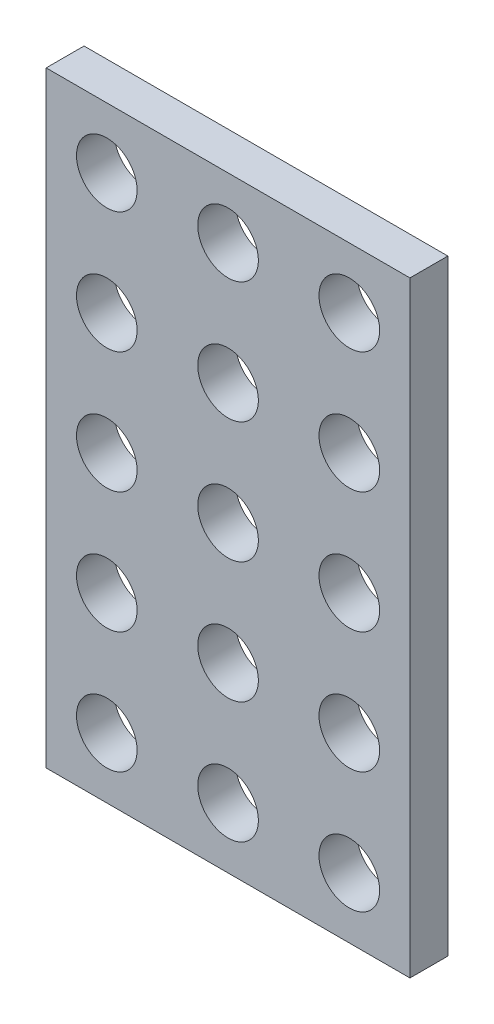
ISO-10303-21;
HEADER;
FILE_DESCRIPTION(('STEP AP214'),'2;1');
FILE_NAME('part.step','',(''),(''),'','','');
FILE_SCHEMA(('AUTOMOTIVE_DESIGN { 1 0 10303 214 1 1 1 1 }'));
ENDSEC;
DATA;
#1=APPLICATION_CONTEXT('core data for automotive mechanical design processes');
#2=APPLICATION_PROTOCOL_DEFINITION('international standard','automotive_design',2000,#1);
#3=PRODUCT_CONTEXT('',#1,'mechanical');
#4=PRODUCT('Part','Part','',(#3));
#5=PRODUCT_RELATED_PRODUCT_CATEGORY('part','',(#4));
#6=PRODUCT_DEFINITION_FORMATION('','',#4);
#7=PRODUCT_DEFINITION_CONTEXT('part definition',#1,'design');
#8=PRODUCT_DEFINITION('design','',#6,#7);
#9=PRODUCT_DEFINITION_SHAPE('','',#8);
#10=(LENGTH_UNIT() NAMED_UNIT(*) SI_UNIT(.MILLI.,.METRE.));
#11=(NAMED_UNIT(*) PLANE_ANGLE_UNIT() SI_UNIT($,.RADIAN.));
#12=(NAMED_UNIT(*) SI_UNIT($,.STERADIAN.) SOLID_ANGLE_UNIT());
#13=UNCERTAINTY_MEASURE_WITH_UNIT(LENGTH_MEASURE(1.E-05),#10,'distance_accuracy_value','');
#14=(GEOMETRIC_REPRESENTATION_CONTEXT(3) GLOBAL_UNCERTAINTY_ASSIGNED_CONTEXT((#13)) GLOBAL_UNIT_ASSIGNED_CONTEXT((#10,
#11,#12)) REPRESENTATION_CONTEXT('',''));
#15=CARTESIAN_POINT('',(0.,0.,0.));
#16=DIRECTION('',(0.,0.,1.));
#17=DIRECTION('',(1.,0.,0.));
#18=AXIS2_PLACEMENT_3D('',#15,#16,#17);
#19=CARTESIAN_POINT('',(20.,4.,2.5));
#20=DIRECTION('',(-1.,0.,0.));
#21=DIRECTION('',(0.,1.,0.));
#22=AXIS2_PLACEMENT_3D('',#19,#20,#21);
#23=PLANE('',#22);
#24=DIRECTION('',(0.,1.,0.));
#25=VECTOR('',#24,1.);
#26=CARTESIAN_POINT('',(20.00000000001,4.00000000001,0.));
#27=LINE('',#26,#25);
#28=CARTESIAN_POINT('',(20.,-36.,0.));
#29=VERTEX_POINT('',#28);
#30=CARTESIAN_POINT('',(20.,4.,0.));
#31=VERTEX_POINT('',#30);
#32=EDGE_CURVE('E98',#29,#31,#27,.T.);
#33=ORIENTED_EDGE('',*,*,#32,.T.);
#34=DIRECTION('',(0.,0.,-1.));
#35=VECTOR('',#34,1.);
#36=CARTESIAN_POINT('',(20.00000000001,4.00000000001,2.50000000001));
#37=LINE('',#36,#35);
#38=CARTESIAN_POINT('',(20.,4.,2.5));
#39=VERTEX_POINT('',#38);
#40=EDGE_CURVE('E85',#39,#31,#37,.T.);
#41=ORIENTED_EDGE('',*,*,#40,.F.);
#42=DIRECTION('',(0.,1.,0.));
#43=VECTOR('',#42,1.);
#44=CARTESIAN_POINT('',(20.00000000001,4.00000000001,2.50000000001));
#45=LINE('',#44,#43);
#46=CARTESIAN_POINT('',(20.,-36.,2.5));
#47=VERTEX_POINT('',#46);
#48=EDGE_CURVE('E162',#47,#39,#45,.T.);
#49=ORIENTED_EDGE('',*,*,#48,.F.);
#50=DIRECTION('',(0.,0.,-1.));
#51=VECTOR('',#50,1.);
#52=CARTESIAN_POINT('',(20.00000000001,-36.00000000001,2.50000000001));
#53=LINE('',#52,#51);
#54=EDGE_CURVE('E11',#47,#29,#53,.T.);
#55=ORIENTED_EDGE('',*,*,#54,.T.);
#56=EDGE_LOOP('',(#33,#41,#49,#55));
#57=FACE_BOUND('',#56,.T.);
#58=ADVANCED_FACE('F17',(#57),#23,.F.);
#59=CARTESIAN_POINT('',(-4.,-36.,2.5));
#60=DIRECTION('',(0.,1.,0.));
#61=DIRECTION('',(1.,0.,0.));
#62=AXIS2_PLACEMENT_3D('',#59,#60,#61);
#63=PLANE('',#62);
#64=DIRECTION('',(1.,0.,0.));
#65=VECTOR('',#64,1.);
#66=CARTESIAN_POINT('',(-4.00000000000999,-36.00000000001,0.));
#67=LINE('',#66,#65);
#68=CARTESIAN_POINT('',(-4.,-36.,0.));
#69=VERTEX_POINT('',#68);
#70=EDGE_CURVE('E92',#69,#29,#67,.T.);
#71=ORIENTED_EDGE('',*,*,#70,.T.);
#72=ORIENTED_EDGE('',*,*,#54,.F.);
#73=DIRECTION('',(1.,0.,0.));
#74=VECTOR('',#73,1.);
#75=CARTESIAN_POINT('',(-4.00000000000999,-36.00000000001,2.50000000001));
#76=LINE('',#75,#74);
#77=CARTESIAN_POINT('',(-4.,-36.,2.5));
#78=VERTEX_POINT('',#77);
#79=EDGE_CURVE('E99',#78,#47,#76,.T.);
#80=ORIENTED_EDGE('',*,*,#79,.F.);
#81=DIRECTION('',(0.,0.,-1.));
#82=VECTOR('',#81,1.);
#83=CARTESIAN_POINT('',(-4.00000000000999,-36.00000000001,2.50000000001));
#84=LINE('',#83,#82);
#85=EDGE_CURVE('E26',#78,#69,#84,.T.);
#86=ORIENTED_EDGE('',*,*,#85,.T.);
#87=EDGE_LOOP('',(#71,#72,#80,#86));
#88=FACE_BOUND('',#87,.T.);
#89=ADVANCED_FACE('F271',(#88),#63,.F.);
#90=CARTESIAN_POINT('',(-4.,4.,2.5));
#91=DIRECTION('',(1.,0.,0.));
#92=DIRECTION('',(0.,1.,0.));
#93=AXIS2_PLACEMENT_3D('',#90,#91,#92);
#94=PLANE('',#93);
#95=DIRECTION('',(0.,-1.,0.));
#96=VECTOR('',#95,1.);
#97=CARTESIAN_POINT('',(-4.00000000001,4.00000000001,0.));
#98=LINE('',#97,#96);
#99=CARTESIAN_POINT('',(-4.,4.,0.));
#100=VERTEX_POINT('',#99);
#101=EDGE_CURVE('E76',#100,#69,#98,.T.);
#102=ORIENTED_EDGE('',*,*,#101,.T.);
#103=ORIENTED_EDGE('',*,*,#85,.F.);
#104=DIRECTION('',(0.,-1.,0.));
#105=VECTOR('',#104,1.);
#106=CARTESIAN_POINT('',(-4.00000000001,4.00000000001,2.50000000001));
#107=LINE('',#106,#105);
#108=CARTESIAN_POINT('',(-4.,4.,2.5));
#109=VERTEX_POINT('',#108);
#110=EDGE_CURVE('E79',#109,#78,#107,.T.);
#111=ORIENTED_EDGE('',*,*,#110,.F.);
#112=DIRECTION('',(0.,0.,-1.));
#113=VECTOR('',#112,1.);
#114=CARTESIAN_POINT('',(-4.00000000001,4.00000000001,2.50000000001));
#115=LINE('',#114,#113);
#116=EDGE_CURVE('E73',#109,#100,#115,.T.);
#117=ORIENTED_EDGE('',*,*,#116,.T.);
#118=EDGE_LOOP('',(#102,#103,#111,#117));
#119=FACE_BOUND('',#118,.T.);
#120=ADVANCED_FACE('F75',(#119),#94,.F.);
#121=CARTESIAN_POINT('',(-4.,4.,2.5));
#122=DIRECTION('',(0.,-1.,0.));
#123=DIRECTION('',(0.,0.,-1.));
#124=AXIS2_PLACEMENT_3D('',#121,#122,#123);
#125=PLANE('',#124);
#126=DIRECTION('',(-1.,0.,0.));
#127=VECTOR('',#126,1.);
#128=CARTESIAN_POINT('',(-4.00000000001,4.00000000001,0.));
#129=LINE('',#128,#127);
#130=EDGE_CURVE('E91',#31,#100,#129,.T.);
#131=ORIENTED_EDGE('',*,*,#130,.T.);
#132=ORIENTED_EDGE('',*,*,#116,.F.);
#133=DIRECTION('',(-1.,0.,0.));
#134=VECTOR('',#133,1.);
#135=CARTESIAN_POINT('',(-4.00000000001,4.00000000001,2.50000000001));
#136=LINE('',#135,#134);
#137=EDGE_CURVE('E166',#39,#109,#136,.T.);
#138=ORIENTED_EDGE('',*,*,#137,.F.);
#139=ORIENTED_EDGE('',*,*,#40,.T.);
#140=EDGE_LOOP('',(#131,#132,#138,#139));
#141=FACE_BOUND('',#140,.T.);
#142=ADVANCED_FACE('F95',(#141),#125,.F.);
#143=CARTESIAN_POINT('',(0.,0.,0.));
#144=DIRECTION('',(0.,0.,1.));
#145=DIRECTION('',(1.,0.,0.));
#146=AXIS2_PLACEMENT_3D('',#143,#144,#145);
#147=PLANE('',#146);
#148=CARTESIAN_POINT('',(16.00000000001,-32.00000000001,0.));
#149=DIRECTION('',(0.,0.,1.));
#150=DIRECTION('',(0.,-1.,0.));
#151=AXIS2_PLACEMENT_3D('',#148,#149,#150);
#152=CIRCLE('',#151,2.00000000001);
#153=CARTESIAN_POINT('',(16.00000000001,-34.00000000002,0.));
#154=VERTEX_POINT('',#153);
#155=EDGE_CURVE('E284',#154,#154,#152,.T.);
#156=ORIENTED_EDGE('',*,*,#155,.T.);
#157=EDGE_LOOP('',(#156));
#158=FACE_BOUND('',#157,.T.);
#159=CARTESIAN_POINT('',(16.00000000001,-24.00000000001,0.));
#160=DIRECTION('',(0.,0.,1.));
#161=DIRECTION('',(0.,-1.,0.));
#162=AXIS2_PLACEMENT_3D('',#159,#160,#161);
#163=CIRCLE('',#162,2.00000000001);
#164=CARTESIAN_POINT('',(16.00000000001,-26.00000000002,0.));
#165=VERTEX_POINT('',#164);
#166=EDGE_CURVE('E298',#165,#165,#163,.T.);
#167=ORIENTED_EDGE('',*,*,#166,.T.);
#168=EDGE_LOOP('',(#167));
#169=FACE_BOUND('',#168,.T.);
#170=CARTESIAN_POINT('',(16.00000000001,-16.00000000001,0.));
#171=DIRECTION('',(0.,0.,1.));
#172=DIRECTION('',(0.,-1.,0.));
#173=AXIS2_PLACEMENT_3D('',#170,#171,#172);
#174=CIRCLE('',#173,2.00000000001);
#175=CARTESIAN_POINT('',(16.00000000001,-18.00000000002,0.));
#176=VERTEX_POINT('',#175);
#177=EDGE_CURVE('E283',#176,#176,#174,.T.);
#178=ORIENTED_EDGE('',*,*,#177,.T.);
#179=EDGE_LOOP('',(#178));
#180=FACE_BOUND('',#179,.T.);
#181=CARTESIAN_POINT('',(16.00000000001,-8.00000000001,0.));
#182=DIRECTION('',(0.,0.,1.));
#183=DIRECTION('',(0.,-1.,0.));
#184=AXIS2_PLACEMENT_3D('',#181,#182,#183);
#185=CIRCLE('',#184,2.00000000001);
#186=CARTESIAN_POINT('',(16.00000000001,-10.00000000002,0.));
#187=VERTEX_POINT('',#186);
#188=EDGE_CURVE('E309',#187,#187,#185,.T.);
#189=ORIENTED_EDGE('',*,*,#188,.T.);
#190=EDGE_LOOP('',(#189));
#191=FACE_BOUND('',#190,.T.);
#192=CARTESIAN_POINT('',(16.00000000001,0.,0.));
#193=DIRECTION('',(0.,0.,1.));
#194=DIRECTION('',(0.,-1.,0.));
#195=AXIS2_PLACEMENT_3D('',#192,#193,#194);
#196=CIRCLE('',#195,2.00000000001);
#197=CARTESIAN_POINT('',(16.00000000001,-2.00000000001,0.));
#198=VERTEX_POINT('',#197);
#199=EDGE_CURVE('E294',#198,#198,#196,.T.);
#200=ORIENTED_EDGE('',*,*,#199,.T.);
#201=EDGE_LOOP('',(#200));
#202=FACE_BOUND('',#201,.T.);
#203=CARTESIAN_POINT('',(8.00000000001,-32.00000000001,0.));
#204=DIRECTION('',(0.,0.,1.));
#205=DIRECTION('',(0.,-1.,0.));
#206=AXIS2_PLACEMENT_3D('',#203,#204,#205);
#207=CIRCLE('',#206,2.00000000001);
#208=CARTESIAN_POINT('',(8.00000000001,-34.00000000002,0.));
#209=VERTEX_POINT('',#208);
#210=EDGE_CURVE('E293',#209,#209,#207,.T.);
#211=ORIENTED_EDGE('',*,*,#210,.T.);
#212=EDGE_LOOP('',(#211));
#213=FACE_BOUND('',#212,.T.);
#214=CARTESIAN_POINT('',(8.00000000001,-24.00000000001,0.));
#215=DIRECTION('',(0.,0.,1.));
#216=DIRECTION('',(0.,-1.,0.));
#217=AXIS2_PLACEMENT_3D('',#214,#215,#216);
#218=CIRCLE('',#217,2.00000000001);
#219=CARTESIAN_POINT('',(8.00000000001,-26.00000000002,0.));
#220=VERTEX_POINT('',#219);
#221=EDGE_CURVE('E224',#220,#220,#218,.T.);
#222=ORIENTED_EDGE('',*,*,#221,.T.);
#223=EDGE_LOOP('',(#222));
#224=FACE_BOUND('',#223,.T.);
#225=CARTESIAN_POINT('',(8.00000000001,-16.00000000001,0.));
#226=DIRECTION('',(0.,0.,1.));
#227=DIRECTION('',(0.,-1.,0.));
#228=AXIS2_PLACEMENT_3D('',#225,#226,#227);
#229=CIRCLE('',#228,2.00000000001);
#230=CARTESIAN_POINT('',(8.00000000001,-18.00000000002,0.));
#231=VERTEX_POINT('',#230);
#232=EDGE_CURVE('E229',#231,#231,#229,.T.);
#233=ORIENTED_EDGE('',*,*,#232,.T.);
#234=EDGE_LOOP('',(#233));
#235=FACE_BOUND('',#234,.T.);
#236=CARTESIAN_POINT('',(8.00000000001,-8.00000000001,0.));
#237=DIRECTION('',(0.,0.,1.));
#238=DIRECTION('',(0.,-1.,0.));
#239=AXIS2_PLACEMENT_3D('',#236,#237,#238);
#240=CIRCLE('',#239,2.00000000001);
#241=CARTESIAN_POINT('',(8.00000000001,-10.00000000002,0.));
#242=VERTEX_POINT('',#241);
#243=EDGE_CURVE('E118',#242,#242,#240,.T.);
#244=ORIENTED_EDGE('',*,*,#243,.T.);
#245=EDGE_LOOP('',(#244));
#246=FACE_BOUND('',#245,.T.);
#247=CARTESIAN_POINT('',(8.00000000001,0.,0.));
#248=DIRECTION('',(0.,0.,1.));
#249=DIRECTION('',(0.,-1.,0.));
#250=AXIS2_PLACEMENT_3D('',#247,#248,#249);
#251=CIRCLE('',#250,2.00000000001);
#252=CARTESIAN_POINT('',(8.00000000001,-2.00000000001,0.));
#253=VERTEX_POINT('',#252);
#254=EDGE_CURVE('E130',#253,#253,#251,.T.);
#255=ORIENTED_EDGE('',*,*,#254,.T.);
#256=EDGE_LOOP('',(#255));
#257=FACE_BOUND('',#256,.T.);
#258=CARTESIAN_POINT('',(1.00034694469519E-11,-32.00000000001,0.));
#259=DIRECTION('',(0.,0.,1.));
#260=DIRECTION('',(0.,-1.,0.));
#261=AXIS2_PLACEMENT_3D('',#258,#259,#260);
#262=CIRCLE('',#261,2.00000000001);
#263=CARTESIAN_POINT('',(1.00034694469519E-11,-34.00000000002,0.));
#264=VERTEX_POINT('',#263);
#265=EDGE_CURVE('E120',#264,#264,#262,.T.);
#266=ORIENTED_EDGE('',*,*,#265,.T.);
#267=EDGE_LOOP('',(#266));
#268=FACE_BOUND('',#267,.T.);
#269=CARTESIAN_POINT('',(1.0002602085214E-11,-24.00000000001,0.));
#270=DIRECTION('',(0.,0.,1.));
#271=DIRECTION('',(0.,-1.,0.));
#272=AXIS2_PLACEMENT_3D('',#269,#270,#271);
#273=CIRCLE('',#272,2.00000000001);
#274=CARTESIAN_POINT('',(1.0002602085214E-11,-26.00000000002,0.));
#275=VERTEX_POINT('',#274);
#276=EDGE_CURVE('E140',#275,#275,#273,.T.);
#277=ORIENTED_EDGE('',*,*,#276,.T.);
#278=EDGE_LOOP('',(#277));
#279=FACE_BOUND('',#278,.T.);
#280=CARTESIAN_POINT('',(1.0001734723476E-11,-16.00000000001,0.));
#281=DIRECTION('',(0.,0.,1.));
#282=DIRECTION('',(0.,-1.,0.));
#283=AXIS2_PLACEMENT_3D('',#280,#281,#282);
#284=CIRCLE('',#283,2.00000000001);
#285=CARTESIAN_POINT('',(1.0001734723476E-11,-18.00000000002,0.));
#286=VERTEX_POINT('',#285);
#287=EDGE_CURVE('E145',#286,#286,#284,.T.);
#288=ORIENTED_EDGE('',*,*,#287,.T.);
#289=EDGE_LOOP('',(#288));
#290=FACE_BOUND('',#289,.T.);
#291=CARTESIAN_POINT('',(1.0000867361738E-11,-8.00000000001,0.));
#292=DIRECTION('',(0.,0.,1.));
#293=DIRECTION('',(0.,-1.,0.));
#294=AXIS2_PLACEMENT_3D('',#291,#292,#293);
#295=CIRCLE('',#294,2.00000000001);
#296=CARTESIAN_POINT('',(1.0000867361738E-11,-10.00000000002,0.));
#297=VERTEX_POINT('',#296);
#298=EDGE_CURVE('E150',#297,#297,#295,.T.);
#299=ORIENTED_EDGE('',*,*,#298,.T.);
#300=EDGE_LOOP('',(#299));
#301=FACE_BOUND('',#300,.T.);
#302=CARTESIAN_POINT('',(0.,0.,0.));
#303=DIRECTION('',(0.,0.,1.));
#304=DIRECTION('',(0.,-1.,0.));
#305=AXIS2_PLACEMENT_3D('',#302,#303,#304);
#306=CIRCLE('',#305,2.00000000001);
#307=CARTESIAN_POINT('',(0.,-2.00000000001,0.));
#308=VERTEX_POINT('',#307);
#309=EDGE_CURVE('E158',#308,#308,#306,.T.);
#310=ORIENTED_EDGE('',*,*,#309,.T.);
#311=EDGE_LOOP('',(#310));
#312=FACE_BOUND('',#311,.T.);
#313=ORIENTED_EDGE('',*,*,#130,.F.);
#314=ORIENTED_EDGE('',*,*,#32,.F.);
#315=ORIENTED_EDGE('',*,*,#70,.F.);
#316=ORIENTED_EDGE('',*,*,#101,.F.);
#317=EDGE_LOOP('',(#313,#314,#315,#316));
#318=FACE_BOUND('',#317,.T.);
#319=ADVANCED_FACE('F89',(#158,#169,#180,#191,#202,#213,#224,#235,#246,#257,#268,#279,#290,#301,
#312,#318),#147,.F.);
#320=CARTESIAN_POINT('',(0.,0.,2.5));
#321=DIRECTION('',(0.,0.,1.));
#322=DIRECTION('',(1.,0.,0.));
#323=AXIS2_PLACEMENT_3D('',#320,#321,#322);
#324=PLANE('',#323);
#325=CARTESIAN_POINT('',(16.00000000001,-32.00000000001,2.50000000001));
#326=DIRECTION('',(0.,0.,1.));
#327=DIRECTION('',(0.,-1.,0.));
#328=AXIS2_PLACEMENT_3D('',#325,#326,#327);
#329=CIRCLE('',#328,2.00000000001);
#330=CARTESIAN_POINT('',(16.00000000001,-34.00000000002,2.50000000001));
#331=VERTEX_POINT('',#330);
#332=EDGE_CURVE('E288',#331,#331,#329,.T.);
#333=ORIENTED_EDGE('',*,*,#332,.F.);
#334=EDGE_LOOP('',(#333));
#335=FACE_BOUND('',#334,.T.);
#336=CARTESIAN_POINT('',(16.00000000001,-24.00000000001,2.50000000001));
#337=DIRECTION('',(0.,0.,1.));
#338=DIRECTION('',(0.,-1.,0.));
#339=AXIS2_PLACEMENT_3D('',#336,#337,#338);
#340=CIRCLE('',#339,2.00000000001);
#341=CARTESIAN_POINT('',(16.00000000001,-26.00000000002,2.50000000001));
#342=VERTEX_POINT('',#341);
#343=EDGE_CURVE('E302',#342,#342,#340,.T.);
#344=ORIENTED_EDGE('',*,*,#343,.F.);
#345=EDGE_LOOP('',(#344));
#346=FACE_BOUND('',#345,.T.);
#347=CARTESIAN_POINT('',(16.00000000001,-16.00000000001,2.50000000001));
#348=DIRECTION('',(0.,0.,1.));
#349=DIRECTION('',(0.,-1.,0.));
#350=AXIS2_PLACEMENT_3D('',#347,#348,#349);
#351=CIRCLE('',#350,2.00000000001);
#352=CARTESIAN_POINT('',(16.00000000001,-18.00000000002,2.50000000001));
#353=VERTEX_POINT('',#352);
#354=EDGE_CURVE('E313',#353,#353,#351,.T.);
#355=ORIENTED_EDGE('',*,*,#354,.F.);
#356=EDGE_LOOP('',(#355));
#357=FACE_BOUND('',#356,.T.);
#358=CARTESIAN_POINT('',(16.00000000001,-8.00000000001,2.50000000001));
#359=DIRECTION('',(0.,0.,1.));
#360=DIRECTION('',(0.,-1.,0.));
#361=AXIS2_PLACEMENT_3D('',#358,#359,#360);
#362=CIRCLE('',#361,2.00000000001);
#363=CARTESIAN_POINT('',(16.00000000001,-10.00000000002,2.50000000001));
#364=VERTEX_POINT('',#363);
#365=EDGE_CURVE('E305',#364,#364,#362,.T.);
#366=ORIENTED_EDGE('',*,*,#365,.F.);
#367=EDGE_LOOP('',(#366));
#368=FACE_BOUND('',#367,.T.);
#369=CARTESIAN_POINT('',(16.00000000001,0.,2.50000000001));
#370=DIRECTION('',(0.,0.,1.));
#371=DIRECTION('',(0.,-1.,0.));
#372=AXIS2_PLACEMENT_3D('',#369,#370,#371);
#373=CIRCLE('',#372,2.00000000001);
#374=CARTESIAN_POINT('',(16.00000000001,-2.00000000001,2.50000000001));
#375=VERTEX_POINT('',#374);
#376=EDGE_CURVE('E289',#375,#375,#373,.T.);
#377=ORIENTED_EDGE('',*,*,#376,.F.);
#378=EDGE_LOOP('',(#377));
#379=FACE_BOUND('',#378,.T.);
#380=CARTESIAN_POINT('',(8.00000000001,-32.00000000001,2.50000000001));
#381=DIRECTION('',(0.,0.,1.));
#382=DIRECTION('',(0.,-1.,0.));
#383=AXIS2_PLACEMENT_3D('',#380,#381,#382);
#384=CIRCLE('',#383,2.00000000001);
#385=CARTESIAN_POINT('',(8.00000000001,-34.00000000002,2.50000000001));
#386=VERTEX_POINT('',#385);
#387=EDGE_CURVE('E222',#386,#386,#384,.T.);
#388=ORIENTED_EDGE('',*,*,#387,.F.);
#389=EDGE_LOOP('',(#388));
#390=FACE_BOUND('',#389,.T.);
#391=CARTESIAN_POINT('',(8.00000000001,-24.00000000001,2.50000000001));
#392=DIRECTION('',(0.,0.,1.));
#393=DIRECTION('',(0.,-1.,0.));
#394=AXIS2_PLACEMENT_3D('',#391,#392,#393);
#395=CIRCLE('',#394,2.00000000001);
#396=CARTESIAN_POINT('',(8.00000000001,-26.00000000002,2.50000000001));
#397=VERTEX_POINT('',#396);
#398=EDGE_CURVE('E228',#397,#397,#395,.T.);
#399=ORIENTED_EDGE('',*,*,#398,.F.);
#400=EDGE_LOOP('',(#399));
#401=FACE_BOUND('',#400,.T.);
#402=CARTESIAN_POINT('',(8.00000000001,-16.00000000001,2.50000000001));
#403=DIRECTION('',(0.,0.,1.));
#404=DIRECTION('',(0.,-1.,0.));
#405=AXIS2_PLACEMENT_3D('',#402,#403,#404);
#406=CIRCLE('',#405,2.00000000001);
#407=CARTESIAN_POINT('',(8.00000000001,-18.00000000002,2.50000000001));
#408=VERTEX_POINT('',#407);
#409=EDGE_CURVE('E232',#408,#408,#406,.T.);
#410=ORIENTED_EDGE('',*,*,#409,.F.);
#411=EDGE_LOOP('',(#410));
#412=FACE_BOUND('',#411,.T.);
#413=CARTESIAN_POINT('',(8.00000000001,-8.00000000001,2.50000000001));
#414=DIRECTION('',(0.,0.,1.));
#415=DIRECTION('',(0.,-1.,0.));
#416=AXIS2_PLACEMENT_3D('',#413,#414,#415);
#417=CIRCLE('',#416,2.00000000001);
#418=CARTESIAN_POINT('',(8.00000000001,-10.00000000002,2.50000000001));
#419=VERTEX_POINT('',#418);
#420=EDGE_CURVE('E126',#419,#419,#417,.T.);
#421=ORIENTED_EDGE('',*,*,#420,.F.);
#422=EDGE_LOOP('',(#421));
#423=FACE_BOUND('',#422,.T.);
#424=CARTESIAN_POINT('',(8.00000000001,0.,2.50000000001));
#425=DIRECTION('',(0.,0.,1.));
#426=DIRECTION('',(0.,-1.,0.));
#427=AXIS2_PLACEMENT_3D('',#424,#425,#426);
#428=CIRCLE('',#427,2.00000000001);
#429=CARTESIAN_POINT('',(8.00000000001,-2.00000000001,2.50000000001));
#430=VERTEX_POINT('',#429);
#431=EDGE_CURVE('E125',#430,#430,#428,.T.);
#432=ORIENTED_EDGE('',*,*,#431,.F.);
#433=EDGE_LOOP('',(#432));
#434=FACE_BOUND('',#433,.T.);
#435=CARTESIAN_POINT('',(1.00034694469519E-11,-32.00000000001,2.50000000001));
#436=DIRECTION('',(0.,0.,1.));
#437=DIRECTION('',(0.,-1.,0.));
#438=AXIS2_PLACEMENT_3D('',#435,#436,#437);
#439=CIRCLE('',#438,2.00000000001);
#440=CARTESIAN_POINT('',(1.00034694469519E-11,-34.00000000002,2.50000000001));
#441=VERTEX_POINT('',#440);
#442=EDGE_CURVE('E124',#441,#441,#439,.T.);
#443=ORIENTED_EDGE('',*,*,#442,.F.);
#444=EDGE_LOOP('',(#443));
#445=FACE_BOUND('',#444,.T.);
#446=CARTESIAN_POINT('',(1.0002602085214E-11,-24.00000000001,2.50000000001));
#447=DIRECTION('',(0.,0.,1.));
#448=DIRECTION('',(0.,-1.,0.));
#449=AXIS2_PLACEMENT_3D('',#446,#447,#448);
#450=CIRCLE('',#449,2.00000000001);
#451=CARTESIAN_POINT('',(1.0002602085214E-11,-26.00000000002,2.50000000001));
#452=VERTEX_POINT('',#451);
#453=EDGE_CURVE('E144',#452,#452,#450,.T.);
#454=ORIENTED_EDGE('',*,*,#453,.F.);
#455=EDGE_LOOP('',(#454));
#456=FACE_BOUND('',#455,.T.);
#457=CARTESIAN_POINT('',(1.0001734723476E-11,-16.00000000001,2.50000000001));
#458=DIRECTION('',(0.,0.,1.));
#459=DIRECTION('',(0.,-1.,0.));
#460=AXIS2_PLACEMENT_3D('',#457,#458,#459);
#461=CIRCLE('',#460,2.00000000001);
#462=CARTESIAN_POINT('',(1.0001734723476E-11,-18.00000000002,2.50000000001));
#463=VERTEX_POINT('',#462);
#464=EDGE_CURVE('E149',#463,#463,#461,.T.);
#465=ORIENTED_EDGE('',*,*,#464,.F.);
#466=EDGE_LOOP('',(#465));
#467=FACE_BOUND('',#466,.T.);
#468=CARTESIAN_POINT('',(1.0000867361738E-11,-8.00000000001,2.50000000001));
#469=DIRECTION('',(0.,0.,1.));
#470=DIRECTION('',(0.,-1.,0.));
#471=AXIS2_PLACEMENT_3D('',#468,#469,#470);
#472=CIRCLE('',#471,2.00000000001);
#473=CARTESIAN_POINT('',(1.0000867361738E-11,-10.00000000002,2.50000000001));
#474=VERTEX_POINT('',#473);
#475=EDGE_CURVE('E154',#474,#474,#472,.T.);
#476=ORIENTED_EDGE('',*,*,#475,.F.);
#477=EDGE_LOOP('',(#476));
#478=FACE_BOUND('',#477,.T.);
#479=CARTESIAN_POINT('',(0.,0.,2.50000000001));
#480=DIRECTION('',(0.,0.,1.));
#481=DIRECTION('',(0.,-1.,0.));
#482=AXIS2_PLACEMENT_3D('',#479,#480,#481);
#483=CIRCLE('',#482,2.00000000001);
#484=CARTESIAN_POINT('',(0.,-2.00000000001,2.50000000001));
#485=VERTEX_POINT('',#484);
#486=EDGE_CURVE('E159',#485,#485,#483,.T.);
#487=ORIENTED_EDGE('',*,*,#486,.F.);
#488=EDGE_LOOP('',(#487));
#489=FACE_BOUND('',#488,.T.);
#490=ORIENTED_EDGE('',*,*,#48,.T.);
#491=ORIENTED_EDGE('',*,*,#137,.T.);
#492=ORIENTED_EDGE('',*,*,#110,.T.);
#493=ORIENTED_EDGE('',*,*,#79,.T.);
#494=EDGE_LOOP('',(#490,#491,#492,#493));
#495=FACE_BOUND('',#494,.T.);
#496=ADVANCED_FACE('F173',(#335,#346,#357,#368,#379,#390,#401,#412,#423,#434,#445,#456,#467,
#478,#489,#495),#324,.T.);
#497=CARTESIAN_POINT('',(0.,0.,2.5));
#498=DIRECTION('',(0.,0.,-1.));
#499=DIRECTION('',(0.,1.,0.));
#500=AXIS2_PLACEMENT_3D('',#497,#498,#499);
#501=CYLINDRICAL_SURFACE('',#500,2.);
#502=ORIENTED_EDGE('',*,*,#486,.T.);
#503=EDGE_LOOP('',(#502));
#504=FACE_BOUND('',#503,.T.);
#505=ORIENTED_EDGE('',*,*,#309,.F.);
#506=EDGE_LOOP('',(#505));
#507=FACE_BOUND('',#506,.T.);
#508=ADVANCED_FACE('F206',(#504,#507),#501,.F.);
#509=CARTESIAN_POINT('',(0.,-8.,2.5));
#510=DIRECTION('',(0.,0.,-1.));
#511=DIRECTION('',(0.,1.,0.));
#512=AXIS2_PLACEMENT_3D('',#509,#510,#511);
#513=CYLINDRICAL_SURFACE('',#512,2.);
#514=ORIENTED_EDGE('',*,*,#475,.T.);
#515=EDGE_LOOP('',(#514));
#516=FACE_BOUND('',#515,.T.);
#517=ORIENTED_EDGE('',*,*,#298,.F.);
#518=EDGE_LOOP('',(#517));
#519=FACE_BOUND('',#518,.T.);
#520=ADVANCED_FACE('F201',(#516,#519),#513,.F.);
#521=CARTESIAN_POINT('',(0.,-16.,2.5));
#522=DIRECTION('',(0.,0.,-1.));
#523=DIRECTION('',(0.,1.,0.));
#524=AXIS2_PLACEMENT_3D('',#521,#522,#523);
#525=CYLINDRICAL_SURFACE('',#524,2.);
#526=ORIENTED_EDGE('',*,*,#464,.T.);
#527=EDGE_LOOP('',(#526));
#528=FACE_BOUND('',#527,.T.);
#529=ORIENTED_EDGE('',*,*,#287,.F.);
#530=EDGE_LOOP('',(#529));
#531=FACE_BOUND('',#530,.T.);
#532=ADVANCED_FACE('F364',(#528,#531),#525,.F.);
#533=CARTESIAN_POINT('',(0.,-24.,2.5));
#534=DIRECTION('',(0.,0.,-1.));
#535=DIRECTION('',(0.,1.,0.));
#536=AXIS2_PLACEMENT_3D('',#533,#534,#535);
#537=CYLINDRICAL_SURFACE('',#536,2.);
#538=ORIENTED_EDGE('',*,*,#453,.T.);
#539=EDGE_LOOP('',(#538));
#540=FACE_BOUND('',#539,.T.);
#541=ORIENTED_EDGE('',*,*,#276,.F.);
#542=EDGE_LOOP('',(#541));
#543=FACE_BOUND('',#542,.T.);
#544=ADVANCED_FACE('F367',(#540,#543),#537,.F.);
#545=CARTESIAN_POINT('',(0.,-32.,2.5));
#546=DIRECTION('',(0.,0.,-1.));
#547=DIRECTION('',(0.,1.,0.));
#548=AXIS2_PLACEMENT_3D('',#545,#546,#547);
#549=CYLINDRICAL_SURFACE('',#548,2.);
#550=ORIENTED_EDGE('',*,*,#442,.T.);
#551=EDGE_LOOP('',(#550));
#552=FACE_BOUND('',#551,.T.);
#553=ORIENTED_EDGE('',*,*,#265,.F.);
#554=EDGE_LOOP('',(#553));
#555=FACE_BOUND('',#554,.T.);
#556=ADVANCED_FACE('F266',(#552,#555),#549,.F.);
#557=CARTESIAN_POINT('',(8.,0.,2.5));
#558=DIRECTION('',(0.,0.,-1.));
#559=DIRECTION('',(0.,1.,0.));
#560=AXIS2_PLACEMENT_3D('',#557,#558,#559);
#561=CYLINDRICAL_SURFACE('',#560,2.);
#562=ORIENTED_EDGE('',*,*,#431,.T.);
#563=EDGE_LOOP('',(#562));
#564=FACE_BOUND('',#563,.T.);
#565=ORIENTED_EDGE('',*,*,#254,.F.);
#566=EDGE_LOOP('',(#565));
#567=FACE_BOUND('',#566,.T.);
#568=ADVANCED_FACE('F255',(#564,#567),#561,.F.);
#569=CARTESIAN_POINT('',(8.,-8.,2.5));
#570=DIRECTION('',(0.,0.,-1.));
#571=DIRECTION('',(0.,1.,0.));
#572=AXIS2_PLACEMENT_3D('',#569,#570,#571);
#573=CYLINDRICAL_SURFACE('',#572,2.);
#574=ORIENTED_EDGE('',*,*,#420,.T.);
#575=EDGE_LOOP('',(#574));
#576=FACE_BOUND('',#575,.T.);
#577=ORIENTED_EDGE('',*,*,#243,.F.);
#578=EDGE_LOOP('',(#577));
#579=FACE_BOUND('',#578,.T.);
#580=ADVANCED_FACE('F252',(#576,#579),#573,.F.);
#581=CARTESIAN_POINT('',(8.,-16.,2.5));
#582=DIRECTION('',(0.,0.,-1.));
#583=DIRECTION('',(0.,1.,0.));
#584=AXIS2_PLACEMENT_3D('',#581,#582,#583);
#585=CYLINDRICAL_SURFACE('',#584,2.);
#586=ORIENTED_EDGE('',*,*,#409,.T.);
#587=EDGE_LOOP('',(#586));
#588=FACE_BOUND('',#587,.T.);
#589=ORIENTED_EDGE('',*,*,#232,.F.);
#590=EDGE_LOOP('',(#589));
#591=FACE_BOUND('',#590,.T.);
#592=ADVANCED_FACE('F254',(#588,#591),#585,.F.);
#593=CARTESIAN_POINT('',(8.,-24.,2.5));
#594=DIRECTION('',(0.,0.,-1.));
#595=DIRECTION('',(0.,1.,0.));
#596=AXIS2_PLACEMENT_3D('',#593,#594,#595);
#597=CYLINDRICAL_SURFACE('',#596,2.);
#598=ORIENTED_EDGE('',*,*,#398,.T.);
#599=EDGE_LOOP('',(#598));
#600=FACE_BOUND('',#599,.T.);
#601=ORIENTED_EDGE('',*,*,#221,.F.);
#602=EDGE_LOOP('',(#601));
#603=FACE_BOUND('',#602,.T.);
#604=ADVANCED_FACE('F264',(#600,#603),#597,.F.);
#605=CARTESIAN_POINT('',(8.,-32.,2.5));
#606=DIRECTION('',(0.,0.,-1.));
#607=DIRECTION('',(0.,1.,0.));
#608=AXIS2_PLACEMENT_3D('',#605,#606,#607);
#609=CYLINDRICAL_SURFACE('',#608,2.);
#610=ORIENTED_EDGE('',*,*,#387,.T.);
#611=EDGE_LOOP('',(#610));
#612=FACE_BOUND('',#611,.T.);
#613=ORIENTED_EDGE('',*,*,#210,.F.);
#614=EDGE_LOOP('',(#613));
#615=FACE_BOUND('',#614,.T.);
#616=ADVANCED_FACE('F341',(#612,#615),#609,.F.);
#617=CARTESIAN_POINT('',(16.,0.,2.5));
#618=DIRECTION('',(0.,0.,-1.));
#619=DIRECTION('',(0.,1.,0.));
#620=AXIS2_PLACEMENT_3D('',#617,#618,#619);
#621=CYLINDRICAL_SURFACE('',#620,2.);
#622=ORIENTED_EDGE('',*,*,#376,.T.);
#623=EDGE_LOOP('',(#622));
#624=FACE_BOUND('',#623,.T.);
#625=ORIENTED_EDGE('',*,*,#199,.F.);
#626=EDGE_LOOP('',(#625));
#627=FACE_BOUND('',#626,.T.);
#628=ADVANCED_FACE('F560',(#624,#627),#621,.F.);
#629=CARTESIAN_POINT('',(16.,-8.,2.5));
#630=DIRECTION('',(0.,0.,-1.));
#631=DIRECTION('',(0.,1.,0.));
#632=AXIS2_PLACEMENT_3D('',#629,#630,#631);
#633=CYLINDRICAL_SURFACE('',#632,2.);
#634=ORIENTED_EDGE('',*,*,#365,.T.);
#635=EDGE_LOOP('',(#634));
#636=FACE_BOUND('',#635,.T.);
#637=ORIENTED_EDGE('',*,*,#188,.F.);
#638=EDGE_LOOP('',(#637));
#639=FACE_BOUND('',#638,.T.);
#640=ADVANCED_FACE('F581',(#636,#639),#633,.F.);
#641=CARTESIAN_POINT('',(16.,-16.,2.5));
#642=DIRECTION('',(0.,0.,-1.));
#643=DIRECTION('',(0.,1.,0.));
#644=AXIS2_PLACEMENT_3D('',#641,#642,#643);
#645=CYLINDRICAL_SURFACE('',#644,2.);
#646=ORIENTED_EDGE('',*,*,#354,.T.);
#647=EDGE_LOOP('',(#646));
#648=FACE_BOUND('',#647,.T.);
#649=ORIENTED_EDGE('',*,*,#177,.F.);
#650=EDGE_LOOP('',(#649));
#651=FACE_BOUND('',#650,.T.);
#652=ADVANCED_FACE('F586',(#648,#651),#645,.F.);
#653=CARTESIAN_POINT('',(16.,-24.,2.5));
#654=DIRECTION('',(0.,0.,-1.));
#655=DIRECTION('',(0.,1.,0.));
#656=AXIS2_PLACEMENT_3D('',#653,#654,#655);
#657=CYLINDRICAL_SURFACE('',#656,2.);
#658=ORIENTED_EDGE('',*,*,#343,.T.);
#659=EDGE_LOOP('',(#658));
#660=FACE_BOUND('',#659,.T.);
#661=ORIENTED_EDGE('',*,*,#166,.F.);
#662=EDGE_LOOP('',(#661));
#663=FACE_BOUND('',#662,.T.);
#664=ADVANCED_FACE('F597',(#660,#663),#657,.F.);
#665=CARTESIAN_POINT('',(16.,-32.,2.5));
#666=DIRECTION('',(0.,0.,-1.));
#667=DIRECTION('',(0.,1.,0.));
#668=AXIS2_PLACEMENT_3D('',#665,#666,#667);
#669=CYLINDRICAL_SURFACE('',#668,2.);
#670=ORIENTED_EDGE('',*,*,#332,.T.);
#671=EDGE_LOOP('',(#670));
#672=FACE_BOUND('',#671,.T.);
#673=ORIENTED_EDGE('',*,*,#155,.F.);
#674=EDGE_LOOP('',(#673));
#675=FACE_BOUND('',#674,.T.);
#676=ADVANCED_FACE('F617',(#672,#675),#669,.F.);
#677=CLOSED_SHELL('',(#58,#89,#120,#142,#319,#496,#508,#520,#532,#544,#556,#568,#580,#592,#604,
#616,#628,#640,#652,#664,#676));
#678=MANIFOLD_SOLID_BREP('B1',#677);
#679=ADVANCED_BREP_SHAPE_REPRESENTATION('',(#18,#678),#14);
#680=SHAPE_DEFINITION_REPRESENTATION(#9,#679);
ENDSEC;
END-ISO-10303-21;
